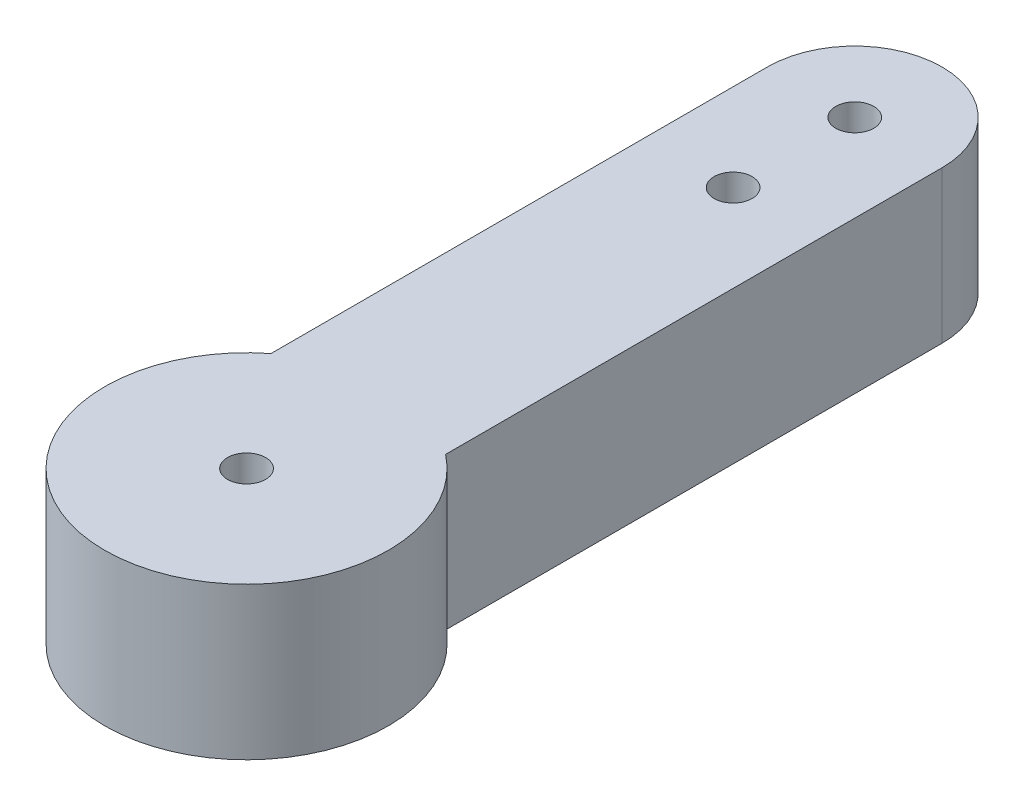
ISO-10303-21;
HEADER;
FILE_DESCRIPTION(('STEP AP214'),'2;1');
FILE_NAME('part.step','',(''),(''),'','','');
FILE_SCHEMA(('AUTOMOTIVE_DESIGN { 1 0 10303 214 1 1 1 1 }'));
ENDSEC;
DATA;
#1=APPLICATION_CONTEXT('core data for automotive mechanical design processes');
#2=APPLICATION_PROTOCOL_DEFINITION('international standard','automotive_design',2000,#1);
#3=PRODUCT_CONTEXT('',#1,'mechanical');
#4=PRODUCT('Part','Part','',(#3));
#5=PRODUCT_RELATED_PRODUCT_CATEGORY('part','',(#4));
#6=PRODUCT_DEFINITION_FORMATION('','',#4);
#7=PRODUCT_DEFINITION_CONTEXT('part definition',#1,'design');
#8=PRODUCT_DEFINITION('design','',#6,#7);
#9=PRODUCT_DEFINITION_SHAPE('','',#8);
#10=(LENGTH_UNIT() NAMED_UNIT(*) SI_UNIT(.MILLI.,.METRE.));
#11=(NAMED_UNIT(*) PLANE_ANGLE_UNIT() SI_UNIT($,.RADIAN.));
#12=(NAMED_UNIT(*) SI_UNIT($,.STERADIAN.) SOLID_ANGLE_UNIT());
#13=UNCERTAINTY_MEASURE_WITH_UNIT(LENGTH_MEASURE(1.E-05),#10,'distance_accuracy_value','');
#14=(GEOMETRIC_REPRESENTATION_CONTEXT(3) GLOBAL_UNCERTAINTY_ASSIGNED_CONTEXT((#13)) GLOBAL_UNIT_ASSIGNED_CONTEXT((#10,
#11,#12)) REPRESENTATION_CONTEXT('',''));
#15=CARTESIAN_POINT('',(0.,0.,0.));
#16=DIRECTION('',(0.,0.,1.));
#17=DIRECTION('',(1.,0.,0.));
#18=AXIS2_PLACEMENT_3D('',#15,#16,#17);
#19=CARTESIAN_POINT('',(0.,6.35,0.));
#20=DIRECTION('',(0.,-1.,0.));
#21=DIRECTION('',(0.,0.,-1.));
#22=AXIS2_PLACEMENT_3D('',#19,#20,#21);
#23=CYLINDRICAL_SURFACE('',#22,5.92246887294652);
#24=CARTESIAN_POINT('',(0.,0.,0.));
#25=DIRECTION('',(0.,1.,0.));
#26=DIRECTION('',(0.,0.,1.));
#27=AXIS2_PLACEMENT_3D('',#24,#25,#26);
#28=CIRCLE('',#27,5.92246887294652);
#29=CARTESIAN_POINT('',(-3.64666915394958,0.,-4.66663065097862));
#30=VERTEX_POINT('',#29);
#31=CARTESIAN_POINT('',(3.64666915394958,0.,-4.66663065097862));
#32=VERTEX_POINT('',#31);
#33=EDGE_CURVE('E113',#30,#32,#28,.T.);
#34=ORIENTED_EDGE('',*,*,#33,.T.);
#35=DIRECTION('',(0.,-1.,0.));
#36=VECTOR('',#35,1.);
#37=CARTESIAN_POINT('',(3.64666915394958,6.35,-4.66663065097862));
#38=LINE('',#37,#36);
#39=CARTESIAN_POINT('',(3.64666915394958,6.35,-4.66663065097862));
#40=VERTEX_POINT('',#39);
#41=EDGE_CURVE('E11',#40,#32,#38,.T.);
#42=ORIENTED_EDGE('',*,*,#41,.F.);
#43=CARTESIAN_POINT('',(0.,6.35,0.));
#44=DIRECTION('',(0.,1.,0.));
#45=DIRECTION('',(0.,0.,1.));
#46=AXIS2_PLACEMENT_3D('',#43,#44,#45);
#47=CIRCLE('',#46,5.92246887294652);
#48=CARTESIAN_POINT('',(-3.64666915394958,6.35,-4.66663065097862));
#49=VERTEX_POINT('',#48);
#50=EDGE_CURVE('E81',#49,#40,#47,.T.);
#51=ORIENTED_EDGE('',*,*,#50,.F.);
#52=DIRECTION('',(0.,-1.,0.));
#53=VECTOR('',#52,1.);
#54=CARTESIAN_POINT('',(-3.64666915394958,6.35,-4.66663065097862));
#55=LINE('',#54,#53);
#56=EDGE_CURVE('E112',#49,#30,#55,.T.);
#57=ORIENTED_EDGE('',*,*,#56,.T.);
#58=EDGE_LOOP('',(#34,#42,#51,#57));
#59=FACE_BOUND('',#58,.T.);
#60=ADVANCED_FACE('F39',(#59),#23,.T.);
#61=CARTESIAN_POINT('',(3.64666915394958,6.35,0.));
#62=DIRECTION('',(1.,0.,0.));
#63=DIRECTION('',(0.,0.,-1.));
#64=AXIS2_PLACEMENT_3D('',#61,#62,#63);
#65=PLANE('',#64);
#66=DIRECTION('',(0.,0.,1.));
#67=VECTOR('',#66,1.);
#68=CARTESIAN_POINT('',(3.64666915394958,0.,0.));
#69=LINE('',#68,#67);
#70=CARTESIAN_POINT('',(3.64666915394958,0.,-25.4));
#71=VERTEX_POINT('',#70);
#72=EDGE_CURVE('E91',#71,#32,#69,.T.);
#73=ORIENTED_EDGE('',*,*,#72,.F.);
#74=DIRECTION('',(0.,-1.,0.));
#75=VECTOR('',#74,1.);
#76=CARTESIAN_POINT('',(3.64666915394958,6.35,-25.4));
#77=LINE('',#76,#75);
#78=CARTESIAN_POINT('',(3.64666915394958,6.35,-25.4));
#79=VERTEX_POINT('',#78);
#80=EDGE_CURVE('E47',#79,#71,#77,.T.);
#81=ORIENTED_EDGE('',*,*,#80,.F.);
#82=DIRECTION('',(0.,0.,1.));
#83=VECTOR('',#82,1.);
#84=CARTESIAN_POINT('',(3.64666915394958,6.35,0.));
#85=LINE('',#84,#83);
#86=EDGE_CURVE('E89',#79,#40,#85,.T.);
#87=ORIENTED_EDGE('',*,*,#86,.T.);
#88=ORIENTED_EDGE('',*,*,#41,.T.);
#89=EDGE_LOOP('',(#73,#81,#87,#88));
#90=FACE_BOUND('',#89,.T.);
#91=ADVANCED_FACE('F88',(#90),#65,.T.);
#92=CARTESIAN_POINT('',(0.,6.35,-25.4));
#93=DIRECTION('',(0.,-1.,0.));
#94=DIRECTION('',(0.,0.,-1.));
#95=AXIS2_PLACEMENT_3D('',#92,#93,#94);
#96=CYLINDRICAL_SURFACE('',#95,3.64666915394958);
#97=CARTESIAN_POINT('',(0.,0.,-25.4));
#98=DIRECTION('',(0.,1.,0.));
#99=DIRECTION('',(0.,0.,1.));
#100=AXIS2_PLACEMENT_3D('',#97,#98,#99);
#101=CIRCLE('',#100,3.64666915394958);
#102=CARTESIAN_POINT('',(-3.64666915394958,0.,-25.4));
#103=VERTEX_POINT('',#102);
#104=EDGE_CURVE('E70',#71,#103,#101,.T.);
#105=ORIENTED_EDGE('',*,*,#104,.T.);
#106=DIRECTION('',(0.,-1.,0.));
#107=VECTOR('',#106,1.);
#108=CARTESIAN_POINT('',(-3.64666915394958,6.35,-25.4));
#109=LINE('',#108,#107);
#110=CARTESIAN_POINT('',(-3.64666915394958,6.35,-25.4));
#111=VERTEX_POINT('',#110);
#112=EDGE_CURVE('E92',#111,#103,#109,.T.);
#113=ORIENTED_EDGE('',*,*,#112,.F.);
#114=CARTESIAN_POINT('',(0.,6.35,-25.4));
#115=DIRECTION('',(0.,1.,0.));
#116=DIRECTION('',(0.,0.,1.));
#117=AXIS2_PLACEMENT_3D('',#114,#115,#116);
#118=CIRCLE('',#117,3.64666915394958);
#119=EDGE_CURVE('E93',#79,#111,#118,.T.);
#120=ORIENTED_EDGE('',*,*,#119,.F.);
#121=ORIENTED_EDGE('',*,*,#80,.T.);
#122=EDGE_LOOP('',(#105,#113,#120,#121));
#123=FACE_BOUND('',#122,.T.);
#124=ADVANCED_FACE('F94',(#123),#96,.T.);
#125=CARTESIAN_POINT('',(0.,6.35,-25.4));
#126=DIRECTION('',(0.,-1.,0.));
#127=DIRECTION('',(0.,0.,-1.));
#128=AXIS2_PLACEMENT_3D('',#125,#126,#127);
#129=CYLINDRICAL_SURFACE('',#128,0.79375);
#130=CARTESIAN_POINT('',(0.,6.35,-25.4));
#131=DIRECTION('',(0.,1.,0.));
#132=DIRECTION('',(0.,0.,1.));
#133=AXIS2_PLACEMENT_3D('',#130,#131,#132);
#134=CIRCLE('',#133,0.79375);
#135=CARTESIAN_POINT('',(0.,6.35,-24.60625));
#136=VERTEX_POINT('',#135);
#137=EDGE_CURVE('E106',#136,#136,#134,.T.);
#138=ORIENTED_EDGE('',*,*,#137,.T.);
#139=EDGE_LOOP('',(#138));
#140=FACE_BOUND('',#139,.T.);
#141=CARTESIAN_POINT('',(0.,0.,-25.4));
#142=DIRECTION('',(0.,1.,0.));
#143=DIRECTION('',(0.,0.,1.));
#144=AXIS2_PLACEMENT_3D('',#141,#142,#143);
#145=CIRCLE('',#144,0.79375);
#146=CARTESIAN_POINT('',(0.,0.,-24.60625));
#147=VERTEX_POINT('',#146);
#148=EDGE_CURVE('E122',#147,#147,#145,.T.);
#149=ORIENTED_EDGE('',*,*,#148,.F.);
#150=EDGE_LOOP('',(#149));
#151=FACE_BOUND('',#150,.T.);
#152=ADVANCED_FACE('F141',(#140,#151),#129,.F.);
#153=CARTESIAN_POINT('',(0.,6.35,-20.32));
#154=DIRECTION('',(0.,-1.,0.));
#155=DIRECTION('',(0.,0.,-1.));
#156=AXIS2_PLACEMENT_3D('',#153,#154,#155);
#157=CYLINDRICAL_SURFACE('',#156,0.79375);
#158=CARTESIAN_POINT('',(0.,6.35,-20.32));
#159=DIRECTION('',(0.,1.,0.));
#160=DIRECTION('',(0.,0.,1.));
#161=AXIS2_PLACEMENT_3D('',#158,#159,#160);
#162=CIRCLE('',#161,0.79375);
#163=CARTESIAN_POINT('',(0.,6.35,-19.52625));
#164=VERTEX_POINT('',#163);
#165=EDGE_CURVE('E103',#164,#164,#162,.T.);
#166=ORIENTED_EDGE('',*,*,#165,.T.);
#167=EDGE_LOOP('',(#166));
#168=FACE_BOUND('',#167,.T.);
#169=CARTESIAN_POINT('',(0.,0.,-20.32));
#170=DIRECTION('',(0.,1.,0.));
#171=DIRECTION('',(0.,0.,1.));
#172=AXIS2_PLACEMENT_3D('',#169,#170,#171);
#173=CIRCLE('',#172,0.79375);
#174=CARTESIAN_POINT('',(0.,0.,-19.52625));
#175=VERTEX_POINT('',#174);
#176=EDGE_CURVE('E119',#175,#175,#173,.T.);
#177=ORIENTED_EDGE('',*,*,#176,.F.);
#178=EDGE_LOOP('',(#177));
#179=FACE_BOUND('',#178,.T.);
#180=ADVANCED_FACE('F147',(#168,#179),#157,.F.);
#181=CARTESIAN_POINT('',(-3.64666915394958,6.35,0.));
#182=DIRECTION('',(1.,0.,0.));
#183=DIRECTION('',(0.,0.,-1.));
#184=AXIS2_PLACEMENT_3D('',#181,#182,#183);
#185=PLANE('',#184);
#186=DIRECTION('',(0.,0.,1.));
#187=VECTOR('',#186,1.);
#188=CARTESIAN_POINT('',(-3.64666915394958,0.,0.));
#189=LINE('',#188,#187);
#190=EDGE_CURVE('E76',#103,#30,#189,.T.);
#191=ORIENTED_EDGE('',*,*,#190,.T.);
#192=ORIENTED_EDGE('',*,*,#56,.F.);
#193=DIRECTION('',(0.,0.,1.));
#194=VECTOR('',#193,1.);
#195=CARTESIAN_POINT('',(-3.64666915394958,6.35,0.));
#196=LINE('',#195,#194);
#197=EDGE_CURVE('E55',#111,#49,#196,.T.);
#198=ORIENTED_EDGE('',*,*,#197,.F.);
#199=ORIENTED_EDGE('',*,*,#112,.T.);
#200=EDGE_LOOP('',(#191,#192,#198,#199));
#201=FACE_BOUND('',#200,.T.);
#202=ADVANCED_FACE('F128',(#201),#185,.F.);
#203=CARTESIAN_POINT('',(0.,6.35,0.));
#204=DIRECTION('',(0.,-1.,0.));
#205=DIRECTION('',(0.,0.,-1.));
#206=AXIS2_PLACEMENT_3D('',#203,#204,#205);
#207=CYLINDRICAL_SURFACE('',#206,0.79375);
#208=CARTESIAN_POINT('',(0.,6.35,0.));
#209=DIRECTION('',(0.,1.,0.));
#210=DIRECTION('',(0.,0.,1.));
#211=AXIS2_PLACEMENT_3D('',#208,#209,#210);
#212=CIRCLE('',#211,0.79375);
#213=CARTESIAN_POINT('',(0.,6.35,0.79375));
#214=VERTEX_POINT('',#213);
#215=EDGE_CURVE('E109',#214,#214,#212,.T.);
#216=ORIENTED_EDGE('',*,*,#215,.T.);
#217=EDGE_LOOP('',(#216));
#218=FACE_BOUND('',#217,.T.);
#219=CARTESIAN_POINT('',(0.,0.,0.));
#220=DIRECTION('',(0.,1.,0.));
#221=DIRECTION('',(0.,0.,1.));
#222=AXIS2_PLACEMENT_3D('',#219,#220,#221);
#223=CIRCLE('',#222,0.79375);
#224=CARTESIAN_POINT('',(0.,0.,0.79375));
#225=VERTEX_POINT('',#224);
#226=EDGE_CURVE('E99',#225,#225,#223,.T.);
#227=ORIENTED_EDGE('',*,*,#226,.F.);
#228=EDGE_LOOP('',(#227));
#229=FACE_BOUND('',#228,.T.);
#230=ADVANCED_FACE('F146',(#218,#229),#207,.F.);
#231=CARTESIAN_POINT('',(0.,6.35,0.));
#232=DIRECTION('',(0.,1.,0.));
#233=DIRECTION('',(0.,0.,1.));
#234=AXIS2_PLACEMENT_3D('',#231,#232,#233);
#235=PLANE('',#234);
#236=ORIENTED_EDGE('',*,*,#50,.T.);
#237=ORIENTED_EDGE('',*,*,#86,.F.);
#238=ORIENTED_EDGE('',*,*,#119,.T.);
#239=ORIENTED_EDGE('',*,*,#197,.T.);
#240=EDGE_LOOP('',(#236,#237,#238,#239));
#241=FACE_BOUND('',#240,.T.);
#242=ORIENTED_EDGE('',*,*,#165,.F.);
#243=EDGE_LOOP('',(#242));
#244=FACE_BOUND('',#243,.T.);
#245=ORIENTED_EDGE('',*,*,#137,.F.);
#246=EDGE_LOOP('',(#245));
#247=FACE_BOUND('',#246,.T.);
#248=ORIENTED_EDGE('',*,*,#215,.F.);
#249=EDGE_LOOP('',(#248));
#250=FACE_BOUND('',#249,.T.);
#251=ADVANCED_FACE('F96',(#241,#244,#247,#250),#235,.T.);
#252=CARTESIAN_POINT('',(0.,0.,0.));
#253=DIRECTION('',(0.,1.,0.));
#254=DIRECTION('',(0.,0.,1.));
#255=AXIS2_PLACEMENT_3D('',#252,#253,#254);
#256=PLANE('',#255);
#257=ORIENTED_EDGE('',*,*,#33,.F.);
#258=ORIENTED_EDGE('',*,*,#190,.F.);
#259=ORIENTED_EDGE('',*,*,#104,.F.);
#260=ORIENTED_EDGE('',*,*,#72,.T.);
#261=EDGE_LOOP('',(#257,#258,#259,#260));
#262=FACE_BOUND('',#261,.T.);
#263=ORIENTED_EDGE('',*,*,#176,.T.);
#264=EDGE_LOOP('',(#263));
#265=FACE_BOUND('',#264,.T.);
#266=ORIENTED_EDGE('',*,*,#148,.T.);
#267=EDGE_LOOP('',(#266));
#268=FACE_BOUND('',#267,.T.);
#269=ORIENTED_EDGE('',*,*,#226,.T.);
#270=EDGE_LOOP('',(#269));
#271=FACE_BOUND('',#270,.T.);
#272=ADVANCED_FACE('F131',(#262,#265,#268,#271),#256,.F.);
#273=CLOSED_SHELL('',(#60,#91,#124,#152,#180,#202,#230,#251,#272));
#274=MANIFOLD_SOLID_BREP('B2',#273);
#275=ADVANCED_BREP_SHAPE_REPRESENTATION('',(#18,#274),#14);
#276=SHAPE_DEFINITION_REPRESENTATION(#9,#275);
ENDSEC;
END-ISO-10303-21;
